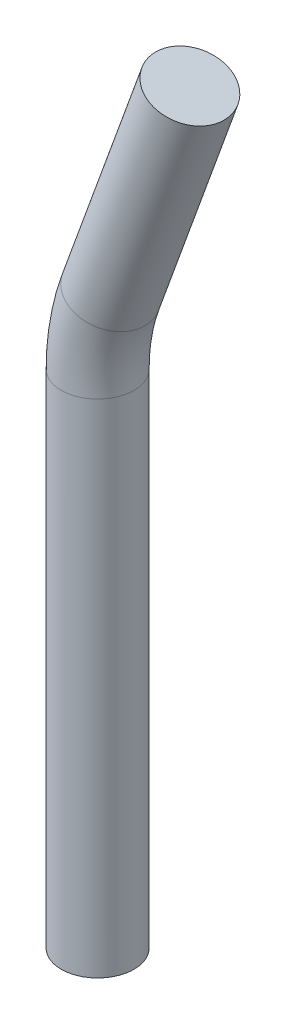
ISO-10303-21;
HEADER;
FILE_DESCRIPTION(('STEP AP214'),'2;1');
FILE_NAME('part.step','',(''),(''),'','','');
FILE_SCHEMA(('AUTOMOTIVE_DESIGN { 1 0 10303 214 1 1 1 1 }'));
ENDSEC;
DATA;
#1=APPLICATION_CONTEXT('core data for automotive mechanical design processes');
#2=APPLICATION_PROTOCOL_DEFINITION('international standard','automotive_design',2000,#1);
#3=PRODUCT_CONTEXT('',#1,'mechanical');
#4=PRODUCT('Part','Part','',(#3));
#5=PRODUCT_RELATED_PRODUCT_CATEGORY('part','',(#4));
#6=PRODUCT_DEFINITION_FORMATION('','',#4);
#7=PRODUCT_DEFINITION_CONTEXT('part definition',#1,'design');
#8=PRODUCT_DEFINITION('design','',#6,#7);
#9=PRODUCT_DEFINITION_SHAPE('','',#8);
#10=(LENGTH_UNIT() NAMED_UNIT(*) SI_UNIT(.MILLI.,.METRE.));
#11=(NAMED_UNIT(*) PLANE_ANGLE_UNIT() SI_UNIT($,.RADIAN.));
#12=(NAMED_UNIT(*) SI_UNIT($,.STERADIAN.) SOLID_ANGLE_UNIT());
#13=UNCERTAINTY_MEASURE_WITH_UNIT(LENGTH_MEASURE(1.E-05),#10,'distance_accuracy_value','');
#14=(GEOMETRIC_REPRESENTATION_CONTEXT(3) GLOBAL_UNCERTAINTY_ASSIGNED_CONTEXT((#13)) GLOBAL_UNIT_ASSIGNED_CONTEXT((#10,
#11,#12)) REPRESENTATION_CONTEXT('',''));
#15=CARTESIAN_POINT('',(0.,0.,0.));
#16=DIRECTION('',(0.,0.,1.));
#17=DIRECTION('',(1.,0.,0.));
#18=AXIS2_PLACEMENT_3D('',#15,#16,#17);
#19=CARTESIAN_POINT('',(0.,0.,0.));
#20=DIRECTION('',(0.,1.,0.));
#21=DIRECTION('',(0.,0.,1.));
#22=AXIS2_PLACEMENT_3D('',#19,#20,#21);
#23=PLANE('',#22);
#24=CARTESIAN_POINT('',(0.,0.,0.));
#25=DIRECTION('',(0.,1.,0.));
#26=DIRECTION('',(0.,0.,1.));
#27=AXIS2_PLACEMENT_3D('',#24,#25,#26);
#28=CIRCLE('',#27,6.75);
#29=CARTESIAN_POINT('',(0.,0.,6.75));
#30=VERTEX_POINT('',#29);
#31=EDGE_CURVE('E42',#30,#30,#28,.T.);
#32=ORIENTED_EDGE('',*,*,#31,.F.);
#33=EDGE_LOOP('',(#32));
#34=FACE_BOUND('',#33,.T.);
#35=ADVANCED_FACE('F30',(#34),#23,.F.);
#36=CARTESIAN_POINT('',(17.1010071662835,146.984631039295,0.));
#37=DIRECTION('',(0.34202014332567,0.939692620785908,0.));
#38=DIRECTION('',(0.,0.,1.));
#39=AXIS2_PLACEMENT_3D('',#36,#37,#38);
#40=PLANE('',#39);
#41=CARTESIAN_POINT('',(17.1010071662835,146.984631039295,0.));
#42=DIRECTION('',(0.34202014332567,0.939692620785908,0.));
#43=DIRECTION('',(0.,0.,1.));
#44=AXIS2_PLACEMENT_3D('',#41,#42,#43);
#45=CIRCLE('',#44,6.75);
#46=CARTESIAN_POINT('',(17.1010071662835,146.984631039295,6.75));
#47=VERTEX_POINT('',#46);
#48=EDGE_CURVE('E11',#47,#47,#45,.T.);
#49=ORIENTED_EDGE('',*,*,#48,.T.);
#50=EDGE_LOOP('',(#49));
#51=FACE_BOUND('',#50,.T.);
#52=ADVANCED_FACE('F45',(#51),#40,.T.);
#53=CARTESIAN_POINT('',(0.,0.,0.));
#54=DIRECTION('',(0.,1.,0.));
#55=DIRECTION('',(0.,0.,1.));
#56=AXIS2_PLACEMENT_3D('',#53,#54,#55);
#57=CYLINDRICAL_SURFACE('',#56,6.75);
#58=CARTESIAN_POINT('',(0.,92.9469207716614,0.));
#59=DIRECTION('',(0.,1.,0.));
#60=DIRECTION('',(0.,0.,1.));
#61=AXIS2_PLACEMENT_3D('',#58,#59,#60);
#62=CIRCLE('',#61,6.75);
#63=CARTESIAN_POINT('',(-6.75,92.9469207716614,0.));
#64=VERTEX_POINT('',#63);
#65=EDGE_CURVE('E55',#64,#64,#62,.T.);
#66=ORIENTED_EDGE('',*,*,#65,.F.);
#67=EDGE_LOOP('',(#66));
#68=FACE_BOUND('',#67,.T.);
#69=ORIENTED_EDGE('',*,*,#31,.T.);
#70=EDGE_LOOP('',(#69));
#71=FACE_BOUND('',#70,.T.);
#72=ADVANCED_FACE('F60',(#68,#71),#57,.T.);
#73=CARTESIAN_POINT('',(40.,92.9469207716614,0.));
#74=DIRECTION('',(0.,0.,-1.));
#75=DIRECTION('',(-1.,0.,0.));
#76=AXIS2_PLACEMENT_3D('',#73,#74,#75);
#77=TOROIDAL_SURFACE('',#76,40.,6.75);
#78=CARTESIAN_POINT('',(2.41229516856368,106.627726504688,0.));
#79=DIRECTION('',(0.34202014332567,0.939692620785908,0.));
#80=DIRECTION('',(0.,0.,1.));
#81=AXIS2_PLACEMENT_3D('',#78,#79,#80);
#82=CIRCLE('',#81,6.75);
#83=CARTESIAN_POINT('',(-3.9306300217412,108.936362472136,0.));
#84=VERTEX_POINT('',#83);
#85=EDGE_CURVE('E37',#84,#84,#82,.T.);
#86=CARTESIAN_POINT('',(40.,92.9469207716614,0.));
#87=DIRECTION('',(0.,0.,-1.));
#88=DIRECTION('',(-1.,0.,0.));
#89=AXIS2_PLACEMENT_3D('',#86,#87,#88);
#90=CIRCLE('',#89,46.75);
#91=EDGE_CURVE('',#64,#84,#90,.T.);
#92=ORIENTED_EDGE('',*,*,#65,.T.);
#93=ORIENTED_EDGE('',*,*,#85,.F.);
#94=ORIENTED_EDGE('',*,*,#91,.T.);
#95=ORIENTED_EDGE('',*,*,#91,.F.);
#96=EDGE_LOOP('',(#92,#94,#93,#95));
#97=FACE_BOUND('',#96,.T.);
#98=ADVANCED_FACE('F50',(#97),#77,.T.);
#99=CARTESIAN_POINT('',(2.41229516856367,106.627726504688,0.));
#100=DIRECTION('',(0.34202014332567,0.939692620785908,0.));
#101=DIRECTION('',(-0.939692620785908,0.34202014332567,0.));
#102=AXIS2_PLACEMENT_3D('',#99,#100,#101);
#103=CYLINDRICAL_SURFACE('',#102,6.75);
#104=ORIENTED_EDGE('',*,*,#48,.F.);
#105=EDGE_LOOP('',(#104));
#106=FACE_BOUND('',#105,.T.);
#107=ORIENTED_EDGE('',*,*,#85,.T.);
#108=EDGE_LOOP('',(#107));
#109=FACE_BOUND('',#108,.T.);
#110=ADVANCED_FACE('F47',(#106,#109),#103,.T.);
#111=CLOSED_SHELL('',(#35,#52,#72,#98,#110));
#112=MANIFOLD_SOLID_BREP('B2',#111);
#113=ADVANCED_BREP_SHAPE_REPRESENTATION('',(#18,#112),#14);
#114=SHAPE_DEFINITION_REPRESENTATION(#9,#113);
ENDSEC;
END-ISO-10303-21;
